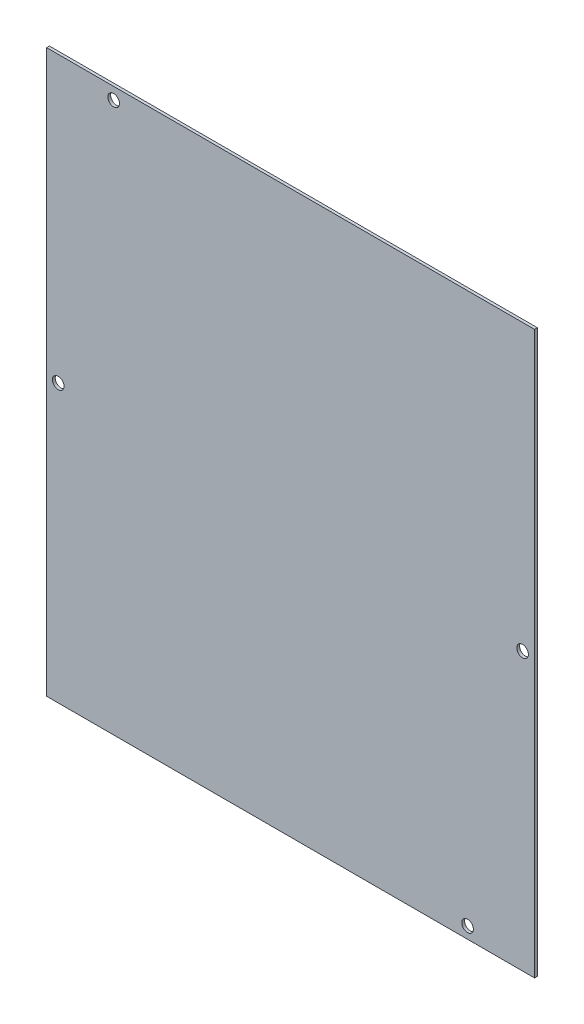
ISO-10303-21;
HEADER;
FILE_DESCRIPTION(('STEP AP214'),'2;1');
FILE_NAME('part.step','',(''),(''),'','','');
FILE_SCHEMA(('AUTOMOTIVE_DESIGN { 1 0 10303 214 1 1 1 1 }'));
ENDSEC;
DATA;
#1=APPLICATION_CONTEXT('core data for automotive mechanical design processes');
#2=APPLICATION_PROTOCOL_DEFINITION('international standard','automotive_design',2000,#1);
#3=PRODUCT_CONTEXT('',#1,'mechanical');
#4=PRODUCT('Part','Part','',(#3));
#5=PRODUCT_RELATED_PRODUCT_CATEGORY('part','',(#4));
#6=PRODUCT_DEFINITION_FORMATION('','',#4);
#7=PRODUCT_DEFINITION_CONTEXT('part definition',#1,'design');
#8=PRODUCT_DEFINITION('design','',#6,#7);
#9=PRODUCT_DEFINITION_SHAPE('','',#8);
#10=(LENGTH_UNIT() NAMED_UNIT(*) SI_UNIT(.MILLI.,.METRE.));
#11=(NAMED_UNIT(*) PLANE_ANGLE_UNIT() SI_UNIT($,.RADIAN.));
#12=(NAMED_UNIT(*) SI_UNIT($,.STERADIAN.) SOLID_ANGLE_UNIT());
#13=UNCERTAINTY_MEASURE_WITH_UNIT(LENGTH_MEASURE(1.E-05),#10,'distance_accuracy_value','');
#14=(GEOMETRIC_REPRESENTATION_CONTEXT(3) GLOBAL_UNCERTAINTY_ASSIGNED_CONTEXT((#13)) GLOBAL_UNIT_ASSIGNED_CONTEXT((#10,
#11,#12)) REPRESENTATION_CONTEXT('',''));
#15=CARTESIAN_POINT('',(0.,0.,0.));
#16=DIRECTION('',(0.,0.,1.));
#17=DIRECTION('',(1.,0.,0.));
#18=AXIS2_PLACEMENT_3D('',#15,#16,#17);
#19=CARTESIAN_POINT('',(165.481,-190.5,-1.905));
#20=DIRECTION('',(1.,0.,0.));
#21=DIRECTION('',(0.,0.,-1.));
#22=AXIS2_PLACEMENT_3D('',#19,#20,#21);
#23=PLANE('',#22);
#24=DIRECTION('',(0.,1.,0.));
#25=VECTOR('',#24,1.);
#26=CARTESIAN_POINT('',(165.481,-190.5,0.));
#27=LINE('',#26,#25);
#28=CARTESIAN_POINT('',(165.481,-190.5,0.));
#29=VERTEX_POINT('',#28);
#30=CARTESIAN_POINT('',(165.481,190.5,0.));
#31=VERTEX_POINT('',#30);
#32=EDGE_CURVE('E125',#29,#31,#27,.T.);
#33=ORIENTED_EDGE('',*,*,#32,.F.);
#34=DIRECTION('',(0.,0.,1.));
#35=VECTOR('',#34,1.);
#36=CARTESIAN_POINT('',(165.481,-190.5,-1.905));
#37=LINE('',#36,#35);
#38=CARTESIAN_POINT('',(165.481,-190.5,-1.905));
#39=VERTEX_POINT('',#38);
#40=EDGE_CURVE('E11',#39,#29,#37,.T.);
#41=ORIENTED_EDGE('',*,*,#40,.F.);
#42=DIRECTION('',(0.,1.,0.));
#43=VECTOR('',#42,1.);
#44=CARTESIAN_POINT('',(165.481,-190.5,-1.905));
#45=LINE('',#44,#43);
#46=CARTESIAN_POINT('',(165.481,190.5,-1.905));
#47=VERTEX_POINT('',#46);
#48=EDGE_CURVE('E113',#39,#47,#45,.T.);
#49=ORIENTED_EDGE('',*,*,#48,.T.);
#50=DIRECTION('',(0.,0.,1.));
#51=VECTOR('',#50,1.);
#52=CARTESIAN_POINT('',(165.481,190.5,-1.905));
#53=LINE('',#52,#51);
#54=EDGE_CURVE('E54',#47,#31,#53,.T.);
#55=ORIENTED_EDGE('',*,*,#54,.T.);
#56=EDGE_LOOP('',(#33,#41,#49,#55));
#57=FACE_BOUND('',#56,.T.);
#58=ADVANCED_FACE('F51',(#57),#23,.T.);
#59=CARTESIAN_POINT('',(-165.481,-190.5,-1.905));
#60=DIRECTION('',(0.,-1.,0.));
#61=DIRECTION('',(0.,0.,-1.));
#62=AXIS2_PLACEMENT_3D('',#59,#60,#61);
#63=PLANE('',#62);
#64=DIRECTION('',(1.,0.,0.));
#65=VECTOR('',#64,1.);
#66=CARTESIAN_POINT('',(-165.481,-190.5,0.));
#67=LINE('',#66,#65);
#68=CARTESIAN_POINT('',(-165.481,-190.5,0.));
#69=VERTEX_POINT('',#68);
#70=EDGE_CURVE('E119',#69,#29,#67,.T.);
#71=ORIENTED_EDGE('',*,*,#70,.F.);
#72=DIRECTION('',(0.,0.,1.));
#73=VECTOR('',#72,1.);
#74=CARTESIAN_POINT('',(-165.481,-190.5,-1.905));
#75=LINE('',#74,#73);
#76=CARTESIAN_POINT('',(-165.481,-190.5,-1.905));
#77=VERTEX_POINT('',#76);
#78=EDGE_CURVE('E61',#77,#69,#75,.T.);
#79=ORIENTED_EDGE('',*,*,#78,.F.);
#80=DIRECTION('',(1.,0.,0.));
#81=VECTOR('',#80,1.);
#82=CARTESIAN_POINT('',(-165.481,-190.5,-1.905));
#83=LINE('',#82,#81);
#84=EDGE_CURVE('E108',#77,#39,#83,.T.);
#85=ORIENTED_EDGE('',*,*,#84,.T.);
#86=ORIENTED_EDGE('',*,*,#40,.T.);
#87=EDGE_LOOP('',(#71,#79,#85,#86));
#88=FACE_BOUND('',#87,.T.);
#89=ADVANCED_FACE('F222',(#88),#63,.T.);
#90=CARTESIAN_POINT('',(-165.481,-190.5,-1.905));
#91=DIRECTION('',(-1.,0.,0.));
#92=DIRECTION('',(0.,0.,1.));
#93=AXIS2_PLACEMENT_3D('',#90,#91,#92);
#94=PLANE('',#93);
#95=DIRECTION('',(0.,-1.,0.));
#96=VECTOR('',#95,1.);
#97=CARTESIAN_POINT('',(-165.481,-190.5,0.));
#98=LINE('',#97,#96);
#99=CARTESIAN_POINT('',(-165.481,190.5,0.));
#100=VERTEX_POINT('',#99);
#101=EDGE_CURVE('E102',#100,#69,#98,.T.);
#102=ORIENTED_EDGE('',*,*,#101,.F.);
#103=DIRECTION('',(0.,0.,1.));
#104=VECTOR('',#103,1.);
#105=CARTESIAN_POINT('',(-165.481,190.5,-1.905));
#106=LINE('',#105,#104);
#107=CARTESIAN_POINT('',(-165.481,190.5,-1.905));
#108=VERTEX_POINT('',#107);
#109=EDGE_CURVE('E97',#108,#100,#106,.T.);
#110=ORIENTED_EDGE('',*,*,#109,.F.);
#111=DIRECTION('',(0.,-1.,0.));
#112=VECTOR('',#111,1.);
#113=CARTESIAN_POINT('',(-165.481,-190.5,-1.905));
#114=LINE('',#113,#112);
#115=EDGE_CURVE('E100',#108,#77,#114,.T.);
#116=ORIENTED_EDGE('',*,*,#115,.T.);
#117=ORIENTED_EDGE('',*,*,#78,.T.);
#118=EDGE_LOOP('',(#102,#110,#116,#117));
#119=FACE_BOUND('',#118,.T.);
#120=ADVANCED_FACE('F99',(#119),#94,.T.);
#121=CARTESIAN_POINT('',(-165.481,190.5,-1.905));
#122=DIRECTION('',(0.,1.,0.));
#123=DIRECTION('',(0.,0.,1.));
#124=AXIS2_PLACEMENT_3D('',#121,#122,#123);
#125=PLANE('',#124);
#126=DIRECTION('',(-1.,0.,0.));
#127=VECTOR('',#126,1.);
#128=CARTESIAN_POINT('',(-165.481,190.5,0.));
#129=LINE('',#128,#127);
#130=EDGE_CURVE('E129',#31,#100,#129,.T.);
#131=ORIENTED_EDGE('',*,*,#130,.F.);
#132=ORIENTED_EDGE('',*,*,#54,.F.);
#133=DIRECTION('',(-1.,0.,0.));
#134=VECTOR('',#133,1.);
#135=CARTESIAN_POINT('',(-165.481,190.5,-1.905));
#136=LINE('',#135,#134);
#137=EDGE_CURVE('E107',#47,#108,#136,.T.);
#138=ORIENTED_EDGE('',*,*,#137,.T.);
#139=ORIENTED_EDGE('',*,*,#109,.T.);
#140=EDGE_LOOP('',(#131,#132,#138,#139));
#141=FACE_BOUND('',#140,.T.);
#142=ADVANCED_FACE('F111',(#141),#125,.T.);
#143=CARTESIAN_POINT('',(0.,0.,-1.905));
#144=DIRECTION('',(0.,0.,-1.));
#145=DIRECTION('',(-1.,0.,0.));
#146=AXIS2_PLACEMENT_3D('',#143,#144,#145);
#147=PLANE('',#146);
#148=CARTESIAN_POINT('',(-120.015,182.372,-1.905));
#149=DIRECTION('',(0.,0.,1.));
#150=DIRECTION('',(1.,0.,0.));
#151=AXIS2_PLACEMENT_3D('',#148,#149,#150);
#152=CIRCLE('',#151,3.937);
#153=CARTESIAN_POINT('',(-116.078,182.372,-1.905));
#154=VERTEX_POINT('',#153);
#155=EDGE_CURVE('E130',#154,#154,#152,.T.);
#156=ORIENTED_EDGE('',*,*,#155,.T.);
#157=EDGE_LOOP('',(#156));
#158=FACE_BOUND('',#157,.T.);
#159=CARTESIAN_POINT('',(-157.607,-2.54000000000001,-1.905));
#160=DIRECTION('',(0.,0.,1.));
#161=DIRECTION('',(1.,0.,0.));
#162=AXIS2_PLACEMENT_3D('',#159,#160,#161);
#163=CIRCLE('',#162,3.937);
#164=CARTESIAN_POINT('',(-153.67,-2.54000000000001,-1.905));
#165=VERTEX_POINT('',#164);
#166=EDGE_CURVE('E152',#165,#165,#163,.T.);
#167=ORIENTED_EDGE('',*,*,#166,.T.);
#168=EDGE_LOOP('',(#167));
#169=FACE_BOUND('',#168,.T.);
#170=CARTESIAN_POINT('',(157.353,-2.54000000000001,-1.905));
#171=DIRECTION('',(0.,0.,1.));
#172=DIRECTION('',(1.,0.,0.));
#173=AXIS2_PLACEMENT_3D('',#170,#171,#172);
#174=CIRCLE('',#173,3.937);
#175=CARTESIAN_POINT('',(161.29,-2.54000000000001,-1.905));
#176=VERTEX_POINT('',#175);
#177=EDGE_CURVE('E142',#176,#176,#174,.T.);
#178=ORIENTED_EDGE('',*,*,#177,.T.);
#179=EDGE_LOOP('',(#178));
#180=FACE_BOUND('',#179,.T.);
#181=CARTESIAN_POINT('',(120.015,-182.626,-1.905));
#182=DIRECTION('',(0.,0.,1.));
#183=DIRECTION('',(1.,0.,0.));
#184=AXIS2_PLACEMENT_3D('',#181,#182,#183);
#185=CIRCLE('',#184,3.937);
#186=CARTESIAN_POINT('',(123.952,-182.626,-1.905));
#187=VERTEX_POINT('',#186);
#188=EDGE_CURVE('E197',#187,#187,#185,.T.);
#189=ORIENTED_EDGE('',*,*,#188,.T.);
#190=EDGE_LOOP('',(#189));
#191=FACE_BOUND('',#190,.T.);
#192=ORIENTED_EDGE('',*,*,#48,.F.);
#193=ORIENTED_EDGE('',*,*,#84,.F.);
#194=ORIENTED_EDGE('',*,*,#115,.F.);
#195=ORIENTED_EDGE('',*,*,#137,.F.);
#196=EDGE_LOOP('',(#192,#193,#194,#195));
#197=FACE_BOUND('',#196,.T.);
#198=ADVANCED_FACE('F106',(#158,#169,#180,#191,#197),#147,.T.);
#199=CARTESIAN_POINT('',(0.,0.,0.));
#200=DIRECTION('',(0.,0.,-1.));
#201=DIRECTION('',(-1.,0.,0.));
#202=AXIS2_PLACEMENT_3D('',#199,#200,#201);
#203=PLANE('',#202);
#204=CARTESIAN_POINT('',(-120.015,182.372,0.));
#205=DIRECTION('',(0.,0.,1.));
#206=DIRECTION('',(1.,0.,0.));
#207=AXIS2_PLACEMENT_3D('',#204,#205,#206);
#208=CIRCLE('',#207,3.937);
#209=CARTESIAN_POINT('',(-116.078,182.372,0.));
#210=VERTEX_POINT('',#209);
#211=EDGE_CURVE('E179',#210,#210,#208,.T.);
#212=ORIENTED_EDGE('',*,*,#211,.F.);
#213=EDGE_LOOP('',(#212));
#214=FACE_BOUND('',#213,.T.);
#215=CARTESIAN_POINT('',(-157.607,-2.54000000000001,0.));
#216=DIRECTION('',(0.,0.,1.));
#217=DIRECTION('',(1.,0.,0.));
#218=AXIS2_PLACEMENT_3D('',#215,#216,#217);
#219=CIRCLE('',#218,3.937);
#220=CARTESIAN_POINT('',(-153.67,-2.54000000000001,0.));
#221=VERTEX_POINT('',#220);
#222=EDGE_CURVE('E155',#221,#221,#219,.T.);
#223=ORIENTED_EDGE('',*,*,#222,.F.);
#224=EDGE_LOOP('',(#223));
#225=FACE_BOUND('',#224,.T.);
#226=CARTESIAN_POINT('',(157.353,-2.54000000000001,0.));
#227=DIRECTION('',(0.,0.,1.));
#228=DIRECTION('',(1.,0.,0.));
#229=AXIS2_PLACEMENT_3D('',#226,#227,#228);
#230=CIRCLE('',#229,3.937);
#231=CARTESIAN_POINT('',(161.29,-2.54000000000001,0.));
#232=VERTEX_POINT('',#231);
#233=EDGE_CURVE('E146',#232,#232,#230,.T.);
#234=ORIENTED_EDGE('',*,*,#233,.F.);
#235=EDGE_LOOP('',(#234));
#236=FACE_BOUND('',#235,.T.);
#237=CARTESIAN_POINT('',(120.015,-182.626,0.));
#238=DIRECTION('',(0.,0.,1.));
#239=DIRECTION('',(1.,0.,0.));
#240=AXIS2_PLACEMENT_3D('',#237,#238,#239);
#241=CIRCLE('',#240,3.937);
#242=CARTESIAN_POINT('',(123.952,-182.626,0.));
#243=VERTEX_POINT('',#242);
#244=EDGE_CURVE('E147',#243,#243,#241,.T.);
#245=ORIENTED_EDGE('',*,*,#244,.F.);
#246=EDGE_LOOP('',(#245));
#247=FACE_BOUND('',#246,.T.);
#248=ORIENTED_EDGE('',*,*,#32,.T.);
#249=ORIENTED_EDGE('',*,*,#130,.T.);
#250=ORIENTED_EDGE('',*,*,#101,.T.);
#251=ORIENTED_EDGE('',*,*,#70,.T.);
#252=EDGE_LOOP('',(#248,#249,#250,#251));
#253=FACE_BOUND('',#252,.T.);
#254=ADVANCED_FACE('F207',(#214,#225,#236,#247,#253),#203,.F.);
#255=CARTESIAN_POINT('',(120.015,-182.626,-1.905));
#256=DIRECTION('',(0.,0.,1.));
#257=DIRECTION('',(1.,0.,0.));
#258=AXIS2_PLACEMENT_3D('',#255,#256,#257);
#259=CYLINDRICAL_SURFACE('',#258,3.937);
#260=CARTESIAN_POINT('',(123.952,-182.626,-1.905));
#261=CARTESIAN_POINT('',(123.952,-182.626,-1.88515625));
#262=CARTESIAN_POINT('',(123.952,-182.626,-1.8653125));
#263=CARTESIAN_POINT('',(123.952,-182.626,-1.825625));
#264=CARTESIAN_POINT('',(123.952,-182.626,-1.80578125));
#265=CARTESIAN_POINT('',(123.952,-182.626,-1.76609375));
#266=CARTESIAN_POINT('',(123.952,-182.626,-1.74625));
#267=CARTESIAN_POINT('',(123.952,-182.626,-1.7065625));
#268=CARTESIAN_POINT('',(123.952,-182.626,-1.68671875));
#269=CARTESIAN_POINT('',(123.952,-182.626,-1.64703125));
#270=CARTESIAN_POINT('',(123.952,-182.626,-1.6271875));
#271=CARTESIAN_POINT('',(123.952,-182.626,-1.5875));
#272=CARTESIAN_POINT('',(123.952,-182.626,-1.56765625));
#273=CARTESIAN_POINT('',(123.952,-182.626,-1.52796875));
#274=CARTESIAN_POINT('',(123.952,-182.626,-1.508125));
#275=CARTESIAN_POINT('',(123.952,-182.626,-1.4684375));
#276=CARTESIAN_POINT('',(123.952,-182.626,-1.44859375));
#277=CARTESIAN_POINT('',(123.952,-182.626,-1.40890625));
#278=CARTESIAN_POINT('',(123.952,-182.626,-1.3890625));
#279=CARTESIAN_POINT('',(123.952,-182.626,-1.349375));
#280=CARTESIAN_POINT('',(123.952,-182.626,-1.32953125));
#281=CARTESIAN_POINT('',(123.952,-182.626,-1.28984375));
#282=CARTESIAN_POINT('',(123.952,-182.626,-1.27));
#283=CARTESIAN_POINT('',(123.952,-182.626,-1.2303125));
#284=CARTESIAN_POINT('',(123.952,-182.626,-1.21046875));
#285=CARTESIAN_POINT('',(123.952,-182.626,-1.17078125));
#286=CARTESIAN_POINT('',(123.952,-182.626,-1.1509375));
#287=CARTESIAN_POINT('',(123.952,-182.626,-1.11125));
#288=CARTESIAN_POINT('',(123.952,-182.626,-1.09140625));
#289=CARTESIAN_POINT('',(123.952,-182.626,-1.05171875));
#290=CARTESIAN_POINT('',(123.952,-182.626,-1.031875));
#291=CARTESIAN_POINT('',(123.952,-182.626,-0.9921875));
#292=CARTESIAN_POINT('',(123.952,-182.626,-0.97234375));
#293=CARTESIAN_POINT('',(123.952,-182.626,-0.93265625));
#294=CARTESIAN_POINT('',(123.952,-182.626,-0.9128125));
#295=CARTESIAN_POINT('',(123.952,-182.626,-0.873125));
#296=CARTESIAN_POINT('',(123.952,-182.626,-0.85328125));
#297=CARTESIAN_POINT('',(123.952,-182.626,-0.81359375));
#298=CARTESIAN_POINT('',(123.952,-182.626,-0.79375));
#299=CARTESIAN_POINT('',(123.952,-182.626,-0.7540625));
#300=CARTESIAN_POINT('',(123.952,-182.626,-0.73421875));
#301=CARTESIAN_POINT('',(123.952,-182.626,-0.69453125));
#302=CARTESIAN_POINT('',(123.952,-182.626,-0.6746875));
#303=CARTESIAN_POINT('',(123.952,-182.626,-0.635));
#304=CARTESIAN_POINT('',(123.952,-182.626,-0.61515625));
#305=CARTESIAN_POINT('',(123.952,-182.626,-0.57546875));
#306=CARTESIAN_POINT('',(123.952,-182.626,-0.555625));
#307=CARTESIAN_POINT('',(123.952,-182.626,-0.5159375));
#308=CARTESIAN_POINT('',(123.952,-182.626,-0.49609375));
#309=CARTESIAN_POINT('',(123.952,-182.626,-0.45640625));
#310=CARTESIAN_POINT('',(123.952,-182.626,-0.4365625));
#311=CARTESIAN_POINT('',(123.952,-182.626,-0.396875));
#312=CARTESIAN_POINT('',(123.952,-182.626,-0.37703125));
#313=CARTESIAN_POINT('',(123.952,-182.626,-0.33734375));
#314=CARTESIAN_POINT('',(123.952,-182.626,-0.3175));
#315=CARTESIAN_POINT('',(123.952,-182.626,-0.2778125));
#316=CARTESIAN_POINT('',(123.952,-182.626,-0.25796875));
#317=CARTESIAN_POINT('',(123.952,-182.626,-0.21828125));
#318=CARTESIAN_POINT('',(123.952,-182.626,-0.1984375));
#319=CARTESIAN_POINT('',(123.952,-182.626,-0.15875));
#320=CARTESIAN_POINT('',(123.952,-182.626,-0.13890625));
#321=CARTESIAN_POINT('',(123.952,-182.626,-0.09921875));
#322=CARTESIAN_POINT('',(123.952,-182.626,-0.0793749999999999));
#323=CARTESIAN_POINT('',(123.952,-182.626,-0.0396874999999999));
#324=CARTESIAN_POINT('',(123.952,-182.626,-0.01984375));
#325=CARTESIAN_POINT('',(123.952,-182.626,0.));
#326=B_SPLINE_CURVE_WITH_KNOTS('',3,(#260,#261,#262,#263,#264,#265,#266,#267,#268,#269,#270,
#271,#272,#273,#274,#275,#276,#277,#278,#279,#280,#281,#282,#283,#284,#285,#286,#287,#288,#289,
#290,#291,#292,#293,#294,#295,#296,#297,#298,#299,#300,#301,#302,#303,#304,#305,#306,#307,#308,
#309,#310,#311,#312,#313,#314,#315,#316,#317,#318,#319,#320,#321,#322,#323,#324,#325),
.UNSPECIFIED.,.F.,.F.,(4,2,2,2,2,2,2,2,2,2,2,2,2,2,2,2,2,2,2,2,2,2,2,2,2,2,2,2,2,2,2,2,4),(0.,
0.0595312499999999,0.1190625,0.17859375,0.238125,0.29765625,0.3571875,0.41671875,0.47625,
0.53578125,0.5953125,0.65484375,0.714375,0.77390625,0.8334375,0.89296875,0.9525,1.01203125,
1.0715625,1.13109375,1.190625,1.25015625,1.3096875,1.36921875,1.42875,1.48828125,1.5478125,
1.60734375,1.666875,1.72640625,1.7859375,1.84546875,1.905),.UNSPECIFIED.);
#327=EDGE_CURVE('BSEAM203',#187,#243,#326,.T.);
#328=ORIENTED_EDGE('',*,*,#188,.F.);
#329=ORIENTED_EDGE('',*,*,#244,.T.);
#330=ORIENTED_EDGE('',*,*,#327,.T.);
#331=ORIENTED_EDGE('',*,*,#327,.F.);
#332=EDGE_LOOP('',(#328,#330,#329,#331));
#333=FACE_BOUND('',#332,.T.);
#334=ADVANCED_FACE('F203',(#333),#259,.F.);
#335=CARTESIAN_POINT('',(157.353,-2.54000000000001,-1.905));
#336=DIRECTION('',(0.,0.,1.));
#337=DIRECTION('',(1.,0.,0.));
#338=AXIS2_PLACEMENT_3D('',#335,#336,#337);
#339=CYLINDRICAL_SURFACE('',#338,3.937);
#340=CARTESIAN_POINT('',(161.29,-2.54000000000001,-1.905));
#341=CARTESIAN_POINT('',(161.29,-2.54000000000001,-1.88515625));
#342=CARTESIAN_POINT('',(161.29,-2.54000000000001,-1.8653125));
#343=CARTESIAN_POINT('',(161.29,-2.54000000000001,-1.825625));
#344=CARTESIAN_POINT('',(161.29,-2.54000000000001,-1.80578125));
#345=CARTESIAN_POINT('',(161.29,-2.54000000000001,-1.76609375));
#346=CARTESIAN_POINT('',(161.29,-2.54000000000001,-1.74625));
#347=CARTESIAN_POINT('',(161.29,-2.54000000000001,-1.7065625));
#348=CARTESIAN_POINT('',(161.29,-2.54000000000001,-1.68671875));
#349=CARTESIAN_POINT('',(161.29,-2.54000000000001,-1.64703125));
#350=CARTESIAN_POINT('',(161.29,-2.54000000000001,-1.6271875));
#351=CARTESIAN_POINT('',(161.29,-2.54000000000001,-1.5875));
#352=CARTESIAN_POINT('',(161.29,-2.54000000000001,-1.56765625));
#353=CARTESIAN_POINT('',(161.29,-2.54000000000001,-1.52796875));
#354=CARTESIAN_POINT('',(161.29,-2.54000000000001,-1.508125));
#355=CARTESIAN_POINT('',(161.29,-2.54000000000001,-1.4684375));
#356=CARTESIAN_POINT('',(161.29,-2.54000000000001,-1.44859375));
#357=CARTESIAN_POINT('',(161.29,-2.54000000000001,-1.40890625));
#358=CARTESIAN_POINT('',(161.29,-2.54000000000001,-1.3890625));
#359=CARTESIAN_POINT('',(161.29,-2.54000000000001,-1.349375));
#360=CARTESIAN_POINT('',(161.29,-2.54000000000001,-1.32953125));
#361=CARTESIAN_POINT('',(161.29,-2.54000000000001,-1.28984375));
#362=CARTESIAN_POINT('',(161.29,-2.54000000000001,-1.27));
#363=CARTESIAN_POINT('',(161.29,-2.54000000000001,-1.2303125));
#364=CARTESIAN_POINT('',(161.29,-2.54000000000001,-1.21046875));
#365=CARTESIAN_POINT('',(161.29,-2.54000000000001,-1.17078125));
#366=CARTESIAN_POINT('',(161.29,-2.54000000000001,-1.1509375));
#367=CARTESIAN_POINT('',(161.29,-2.54000000000001,-1.11125));
#368=CARTESIAN_POINT('',(161.29,-2.54000000000001,-1.09140625));
#369=CARTESIAN_POINT('',(161.29,-2.54000000000001,-1.05171875));
#370=CARTESIAN_POINT('',(161.29,-2.54000000000001,-1.031875));
#371=CARTESIAN_POINT('',(161.29,-2.54000000000001,-0.9921875));
#372=CARTESIAN_POINT('',(161.29,-2.54000000000001,-0.97234375));
#373=CARTESIAN_POINT('',(161.29,-2.54000000000001,-0.93265625));
#374=CARTESIAN_POINT('',(161.29,-2.54000000000001,-0.9128125));
#375=CARTESIAN_POINT('',(161.29,-2.54000000000001,-0.873125));
#376=CARTESIAN_POINT('',(161.29,-2.54000000000001,-0.85328125));
#377=CARTESIAN_POINT('',(161.29,-2.54000000000001,-0.81359375));
#378=CARTESIAN_POINT('',(161.29,-2.54000000000001,-0.79375));
#379=CARTESIAN_POINT('',(161.29,-2.54000000000001,-0.7540625));
#380=CARTESIAN_POINT('',(161.29,-2.54000000000001,-0.73421875));
#381=CARTESIAN_POINT('',(161.29,-2.54000000000001,-0.69453125));
#382=CARTESIAN_POINT('',(161.29,-2.54000000000001,-0.6746875));
#383=CARTESIAN_POINT('',(161.29,-2.54000000000001,-0.635));
#384=CARTESIAN_POINT('',(161.29,-2.54000000000001,-0.61515625));
#385=CARTESIAN_POINT('',(161.29,-2.54000000000001,-0.57546875));
#386=CARTESIAN_POINT('',(161.29,-2.54000000000001,-0.555625));
#387=CARTESIAN_POINT('',(161.29,-2.54000000000001,-0.5159375));
#388=CARTESIAN_POINT('',(161.29,-2.54000000000001,-0.49609375));
#389=CARTESIAN_POINT('',(161.29,-2.54000000000001,-0.45640625));
#390=CARTESIAN_POINT('',(161.29,-2.54000000000001,-0.4365625));
#391=CARTESIAN_POINT('',(161.29,-2.54000000000001,-0.396875));
#392=CARTESIAN_POINT('',(161.29,-2.54000000000001,-0.37703125));
#393=CARTESIAN_POINT('',(161.29,-2.54000000000001,-0.33734375));
#394=CARTESIAN_POINT('',(161.29,-2.54000000000001,-0.3175));
#395=CARTESIAN_POINT('',(161.29,-2.54000000000001,-0.2778125));
#396=CARTESIAN_POINT('',(161.29,-2.54000000000001,-0.25796875));
#397=CARTESIAN_POINT('',(161.29,-2.54000000000001,-0.21828125));
#398=CARTESIAN_POINT('',(161.29,-2.54000000000001,-0.1984375));
#399=CARTESIAN_POINT('',(161.29,-2.54000000000001,-0.15875));
#400=CARTESIAN_POINT('',(161.29,-2.54000000000001,-0.13890625));
#401=CARTESIAN_POINT('',(161.29,-2.54000000000001,-0.09921875));
#402=CARTESIAN_POINT('',(161.29,-2.54000000000001,-0.0793749999999999));
#403=CARTESIAN_POINT('',(161.29,-2.54000000000001,-0.0396874999999999));
#404=CARTESIAN_POINT('',(161.29,-2.54000000000001,-0.01984375));
#405=CARTESIAN_POINT('',(161.29,-2.54000000000001,0.));
#406=B_SPLINE_CURVE_WITH_KNOTS('',3,(#340,#341,#342,#343,#344,#345,#346,#347,#348,#349,#350,
#351,#352,#353,#354,#355,#356,#357,#358,#359,#360,#361,#362,#363,#364,#365,#366,#367,#368,#369,
#370,#371,#372,#373,#374,#375,#376,#377,#378,#379,#380,#381,#382,#383,#384,#385,#386,#387,#388,
#389,#390,#391,#392,#393,#394,#395,#396,#397,#398,#399,#400,#401,#402,#403,#404,#405),
.UNSPECIFIED.,.F.,.F.,(4,2,2,2,2,2,2,2,2,2,2,2,2,2,2,2,2,2,2,2,2,2,2,2,2,2,2,2,2,2,2,2,4),(0.,
0.0595312499999999,0.1190625,0.17859375,0.238125,0.29765625,0.3571875,0.41671875,0.47625,
0.53578125,0.5953125,0.65484375,0.714375,0.77390625,0.8334375,0.89296875,0.9525,1.01203125,
1.0715625,1.13109375,1.190625,1.25015625,1.3096875,1.36921875,1.42875,1.48828125,1.5478125,
1.60734375,1.666875,1.72640625,1.7859375,1.84546875,1.905),.UNSPECIFIED.);
#407=EDGE_CURVE('BSEAM206',#176,#232,#406,.T.);
#408=ORIENTED_EDGE('',*,*,#177,.F.);
#409=ORIENTED_EDGE('',*,*,#233,.T.);
#410=ORIENTED_EDGE('',*,*,#407,.T.);
#411=ORIENTED_EDGE('',*,*,#407,.F.);
#412=EDGE_LOOP('',(#408,#410,#409,#411));
#413=FACE_BOUND('',#412,.T.);
#414=ADVANCED_FACE('F206',(#413),#339,.F.);
#415=CARTESIAN_POINT('',(-157.607,-2.54000000000001,-1.905));
#416=DIRECTION('',(0.,0.,1.));
#417=DIRECTION('',(1.,0.,0.));
#418=AXIS2_PLACEMENT_3D('',#415,#416,#417);
#419=CYLINDRICAL_SURFACE('',#418,3.937);
#420=CARTESIAN_POINT('',(-153.67,-2.54000000000001,-1.905));
#421=CARTESIAN_POINT('',(-153.67,-2.54000000000001,-1.88515625));
#422=CARTESIAN_POINT('',(-153.67,-2.54000000000001,-1.8653125));
#423=CARTESIAN_POINT('',(-153.67,-2.54000000000001,-1.825625));
#424=CARTESIAN_POINT('',(-153.67,-2.54000000000001,-1.80578125));
#425=CARTESIAN_POINT('',(-153.67,-2.54000000000001,-1.76609375));
#426=CARTESIAN_POINT('',(-153.67,-2.54000000000001,-1.74625));
#427=CARTESIAN_POINT('',(-153.67,-2.54000000000001,-1.7065625));
#428=CARTESIAN_POINT('',(-153.67,-2.54000000000001,-1.68671875));
#429=CARTESIAN_POINT('',(-153.67,-2.54000000000001,-1.64703125));
#430=CARTESIAN_POINT('',(-153.67,-2.54000000000001,-1.6271875));
#431=CARTESIAN_POINT('',(-153.67,-2.54000000000001,-1.5875));
#432=CARTESIAN_POINT('',(-153.67,-2.54000000000001,-1.56765625));
#433=CARTESIAN_POINT('',(-153.67,-2.54000000000001,-1.52796875));
#434=CARTESIAN_POINT('',(-153.67,-2.54000000000001,-1.508125));
#435=CARTESIAN_POINT('',(-153.67,-2.54000000000001,-1.4684375));
#436=CARTESIAN_POINT('',(-153.67,-2.54000000000001,-1.44859375));
#437=CARTESIAN_POINT('',(-153.67,-2.54000000000001,-1.40890625));
#438=CARTESIAN_POINT('',(-153.67,-2.54000000000001,-1.3890625));
#439=CARTESIAN_POINT('',(-153.67,-2.54000000000001,-1.349375));
#440=CARTESIAN_POINT('',(-153.67,-2.54000000000001,-1.32953125));
#441=CARTESIAN_POINT('',(-153.67,-2.54000000000001,-1.28984375));
#442=CARTESIAN_POINT('',(-153.67,-2.54000000000001,-1.27));
#443=CARTESIAN_POINT('',(-153.67,-2.54000000000001,-1.2303125));
#444=CARTESIAN_POINT('',(-153.67,-2.54000000000001,-1.21046875));
#445=CARTESIAN_POINT('',(-153.67,-2.54000000000001,-1.17078125));
#446=CARTESIAN_POINT('',(-153.67,-2.54000000000001,-1.1509375));
#447=CARTESIAN_POINT('',(-153.67,-2.54000000000001,-1.11125));
#448=CARTESIAN_POINT('',(-153.67,-2.54000000000001,-1.09140625));
#449=CARTESIAN_POINT('',(-153.67,-2.54000000000001,-1.05171875));
#450=CARTESIAN_POINT('',(-153.67,-2.54000000000001,-1.031875));
#451=CARTESIAN_POINT('',(-153.67,-2.54000000000001,-0.9921875));
#452=CARTESIAN_POINT('',(-153.67,-2.54000000000001,-0.97234375));
#453=CARTESIAN_POINT('',(-153.67,-2.54000000000001,-0.93265625));
#454=CARTESIAN_POINT('',(-153.67,-2.54000000000001,-0.9128125));
#455=CARTESIAN_POINT('',(-153.67,-2.54000000000001,-0.873125));
#456=CARTESIAN_POINT('',(-153.67,-2.54000000000001,-0.85328125));
#457=CARTESIAN_POINT('',(-153.67,-2.54000000000001,-0.81359375));
#458=CARTESIAN_POINT('',(-153.67,-2.54000000000001,-0.79375));
#459=CARTESIAN_POINT('',(-153.67,-2.54000000000001,-0.7540625));
#460=CARTESIAN_POINT('',(-153.67,-2.54000000000001,-0.73421875));
#461=CARTESIAN_POINT('',(-153.67,-2.54000000000001,-0.69453125));
#462=CARTESIAN_POINT('',(-153.67,-2.54000000000001,-0.6746875));
#463=CARTESIAN_POINT('',(-153.67,-2.54000000000001,-0.635));
#464=CARTESIAN_POINT('',(-153.67,-2.54000000000001,-0.61515625));
#465=CARTESIAN_POINT('',(-153.67,-2.54000000000001,-0.57546875));
#466=CARTESIAN_POINT('',(-153.67,-2.54000000000001,-0.555625));
#467=CARTESIAN_POINT('',(-153.67,-2.54000000000001,-0.5159375));
#468=CARTESIAN_POINT('',(-153.67,-2.54000000000001,-0.49609375));
#469=CARTESIAN_POINT('',(-153.67,-2.54000000000001,-0.45640625));
#470=CARTESIAN_POINT('',(-153.67,-2.54000000000001,-0.4365625));
#471=CARTESIAN_POINT('',(-153.67,-2.54000000000001,-0.396875));
#472=CARTESIAN_POINT('',(-153.67,-2.54000000000001,-0.37703125));
#473=CARTESIAN_POINT('',(-153.67,-2.54000000000001,-0.33734375));
#474=CARTESIAN_POINT('',(-153.67,-2.54000000000001,-0.3175));
#475=CARTESIAN_POINT('',(-153.67,-2.54000000000001,-0.2778125));
#476=CARTESIAN_POINT('',(-153.67,-2.54000000000001,-0.25796875));
#477=CARTESIAN_POINT('',(-153.67,-2.54000000000001,-0.21828125));
#478=CARTESIAN_POINT('',(-153.67,-2.54000000000001,-0.1984375));
#479=CARTESIAN_POINT('',(-153.67,-2.54000000000001,-0.15875));
#480=CARTESIAN_POINT('',(-153.67,-2.54000000000001,-0.13890625));
#481=CARTESIAN_POINT('',(-153.67,-2.54000000000001,-0.09921875));
#482=CARTESIAN_POINT('',(-153.67,-2.54000000000001,-0.0793749999999999));
#483=CARTESIAN_POINT('',(-153.67,-2.54000000000001,-0.0396874999999999));
#484=CARTESIAN_POINT('',(-153.67,-2.54000000000001,-0.01984375));
#485=CARTESIAN_POINT('',(-153.67,-2.54000000000001,0.));
#486=B_SPLINE_CURVE_WITH_KNOTS('',3,(#420,#421,#422,#423,#424,#425,#426,#427,#428,#429,#430,
#431,#432,#433,#434,#435,#436,#437,#438,#439,#440,#441,#442,#443,#444,#445,#446,#447,#448,#449,
#450,#451,#452,#453,#454,#455,#456,#457,#458,#459,#460,#461,#462,#463,#464,#465,#466,#467,#468,
#469,#470,#471,#472,#473,#474,#475,#476,#477,#478,#479,#480,#481,#482,#483,#484,#485),
.UNSPECIFIED.,.F.,.F.,(4,2,2,2,2,2,2,2,2,2,2,2,2,2,2,2,2,2,2,2,2,2,2,2,2,2,2,2,2,2,2,2,4),(0.,
0.0595312499999999,0.1190625,0.17859375,0.238125,0.29765625,0.3571875,0.41671875,0.47625,
0.53578125,0.5953125,0.65484375,0.714375,0.77390625,0.8334375,0.89296875,0.9525,1.01203125,
1.0715625,1.13109375,1.190625,1.25015625,1.3096875,1.36921875,1.42875,1.48828125,1.5478125,
1.60734375,1.666875,1.72640625,1.7859375,1.84546875,1.905),.UNSPECIFIED.);
#487=EDGE_CURVE('BSEAM239',#165,#221,#486,.T.);
#488=ORIENTED_EDGE('',*,*,#166,.F.);
#489=ORIENTED_EDGE('',*,*,#222,.T.);
#490=ORIENTED_EDGE('',*,*,#487,.T.);
#491=ORIENTED_EDGE('',*,*,#487,.F.);
#492=EDGE_LOOP('',(#488,#490,#489,#491));
#493=FACE_BOUND('',#492,.T.);
#494=ADVANCED_FACE('F239',(#493),#419,.F.);
#495=CARTESIAN_POINT('',(-120.015,182.372,-1.905));
#496=DIRECTION('',(0.,0.,1.));
#497=DIRECTION('',(1.,0.,0.));
#498=AXIS2_PLACEMENT_3D('',#495,#496,#497);
#499=CYLINDRICAL_SURFACE('',#498,3.937);
#500=CARTESIAN_POINT('',(-116.078,182.372,-1.905));
#501=CARTESIAN_POINT('',(-116.078,182.372,-1.88515625));
#502=CARTESIAN_POINT('',(-116.078,182.372,-1.8653125));
#503=CARTESIAN_POINT('',(-116.078,182.372,-1.825625));
#504=CARTESIAN_POINT('',(-116.078,182.372,-1.80578125));
#505=CARTESIAN_POINT('',(-116.078,182.372,-1.76609375));
#506=CARTESIAN_POINT('',(-116.078,182.372,-1.74625));
#507=CARTESIAN_POINT('',(-116.078,182.372,-1.7065625));
#508=CARTESIAN_POINT('',(-116.078,182.372,-1.68671875));
#509=CARTESIAN_POINT('',(-116.078,182.372,-1.64703125));
#510=CARTESIAN_POINT('',(-116.078,182.372,-1.6271875));
#511=CARTESIAN_POINT('',(-116.078,182.372,-1.5875));
#512=CARTESIAN_POINT('',(-116.078,182.372,-1.56765625));
#513=CARTESIAN_POINT('',(-116.078,182.372,-1.52796875));
#514=CARTESIAN_POINT('',(-116.078,182.372,-1.508125));
#515=CARTESIAN_POINT('',(-116.078,182.372,-1.4684375));
#516=CARTESIAN_POINT('',(-116.078,182.372,-1.44859375));
#517=CARTESIAN_POINT('',(-116.078,182.372,-1.40890625));
#518=CARTESIAN_POINT('',(-116.078,182.372,-1.3890625));
#519=CARTESIAN_POINT('',(-116.078,182.372,-1.349375));
#520=CARTESIAN_POINT('',(-116.078,182.372,-1.32953125));
#521=CARTESIAN_POINT('',(-116.078,182.372,-1.28984375));
#522=CARTESIAN_POINT('',(-116.078,182.372,-1.27));
#523=CARTESIAN_POINT('',(-116.078,182.372,-1.2303125));
#524=CARTESIAN_POINT('',(-116.078,182.372,-1.21046875));
#525=CARTESIAN_POINT('',(-116.078,182.372,-1.17078125));
#526=CARTESIAN_POINT('',(-116.078,182.372,-1.1509375));
#527=CARTESIAN_POINT('',(-116.078,182.372,-1.11125));
#528=CARTESIAN_POINT('',(-116.078,182.372,-1.09140625));
#529=CARTESIAN_POINT('',(-116.078,182.372,-1.05171875));
#530=CARTESIAN_POINT('',(-116.078,182.372,-1.031875));
#531=CARTESIAN_POINT('',(-116.078,182.372,-0.9921875));
#532=CARTESIAN_POINT('',(-116.078,182.372,-0.97234375));
#533=CARTESIAN_POINT('',(-116.078,182.372,-0.93265625));
#534=CARTESIAN_POINT('',(-116.078,182.372,-0.9128125));
#535=CARTESIAN_POINT('',(-116.078,182.372,-0.873125));
#536=CARTESIAN_POINT('',(-116.078,182.372,-0.85328125));
#537=CARTESIAN_POINT('',(-116.078,182.372,-0.81359375));
#538=CARTESIAN_POINT('',(-116.078,182.372,-0.79375));
#539=CARTESIAN_POINT('',(-116.078,182.372,-0.7540625));
#540=CARTESIAN_POINT('',(-116.078,182.372,-0.73421875));
#541=CARTESIAN_POINT('',(-116.078,182.372,-0.69453125));
#542=CARTESIAN_POINT('',(-116.078,182.372,-0.6746875));
#543=CARTESIAN_POINT('',(-116.078,182.372,-0.635));
#544=CARTESIAN_POINT('',(-116.078,182.372,-0.61515625));
#545=CARTESIAN_POINT('',(-116.078,182.372,-0.57546875));
#546=CARTESIAN_POINT('',(-116.078,182.372,-0.555625));
#547=CARTESIAN_POINT('',(-116.078,182.372,-0.5159375));
#548=CARTESIAN_POINT('',(-116.078,182.372,-0.49609375));
#549=CARTESIAN_POINT('',(-116.078,182.372,-0.45640625));
#550=CARTESIAN_POINT('',(-116.078,182.372,-0.4365625));
#551=CARTESIAN_POINT('',(-116.078,182.372,-0.396875));
#552=CARTESIAN_POINT('',(-116.078,182.372,-0.37703125));
#553=CARTESIAN_POINT('',(-116.078,182.372,-0.33734375));
#554=CARTESIAN_POINT('',(-116.078,182.372,-0.3175));
#555=CARTESIAN_POINT('',(-116.078,182.372,-0.2778125));
#556=CARTESIAN_POINT('',(-116.078,182.372,-0.25796875));
#557=CARTESIAN_POINT('',(-116.078,182.372,-0.21828125));
#558=CARTESIAN_POINT('',(-116.078,182.372,-0.1984375));
#559=CARTESIAN_POINT('',(-116.078,182.372,-0.15875));
#560=CARTESIAN_POINT('',(-116.078,182.372,-0.13890625));
#561=CARTESIAN_POINT('',(-116.078,182.372,-0.09921875));
#562=CARTESIAN_POINT('',(-116.078,182.372,-0.0793749999999999));
#563=CARTESIAN_POINT('',(-116.078,182.372,-0.0396874999999999));
#564=CARTESIAN_POINT('',(-116.078,182.372,-0.01984375));
#565=CARTESIAN_POINT('',(-116.078,182.372,0.));
#566=B_SPLINE_CURVE_WITH_KNOTS('',3,(#500,#501,#502,#503,#504,#505,#506,#507,#508,#509,#510,
#511,#512,#513,#514,#515,#516,#517,#518,#519,#520,#521,#522,#523,#524,#525,#526,#527,#528,#529,
#530,#531,#532,#533,#534,#535,#536,#537,#538,#539,#540,#541,#542,#543,#544,#545,#546,#547,#548,
#549,#550,#551,#552,#553,#554,#555,#556,#557,#558,#559,#560,#561,#562,#563,#564,#565),
.UNSPECIFIED.,.F.,.F.,(4,2,2,2,2,2,2,2,2,2,2,2,2,2,2,2,2,2,2,2,2,2,2,2,2,2,2,2,2,2,2,2,4),(0.,
0.0595312499999999,0.1190625,0.17859375,0.238125,0.29765625,0.3571875,0.41671875,0.47625,
0.53578125,0.5953125,0.65484375,0.714375,0.77390625,0.8334375,0.89296875,0.9525,1.01203125,
1.0715625,1.13109375,1.190625,1.25015625,1.3096875,1.36921875,1.42875,1.48828125,1.5478125,
1.60734375,1.666875,1.72640625,1.7859375,1.84546875,1.905),.UNSPECIFIED.);
#567=EDGE_CURVE('BSEAM243',#154,#210,#566,.T.);
#568=ORIENTED_EDGE('',*,*,#155,.F.);
#569=ORIENTED_EDGE('',*,*,#211,.T.);
#570=ORIENTED_EDGE('',*,*,#567,.T.);
#571=ORIENTED_EDGE('',*,*,#567,.F.);
#572=EDGE_LOOP('',(#568,#570,#569,#571));
#573=FACE_BOUND('',#572,.T.);
#574=ADVANCED_FACE('F243',(#573),#499,.F.);
#575=CLOSED_SHELL('',(#58,#89,#120,#142,#198,#254,#334,#414,#494,#574));
#576=MANIFOLD_SOLID_BREP('B2',#575);
#577=ADVANCED_BREP_SHAPE_REPRESENTATION('',(#18,#576),#14);
#578=SHAPE_DEFINITION_REPRESENTATION(#9,#577);
ENDSEC;
END-ISO-10303-21;
